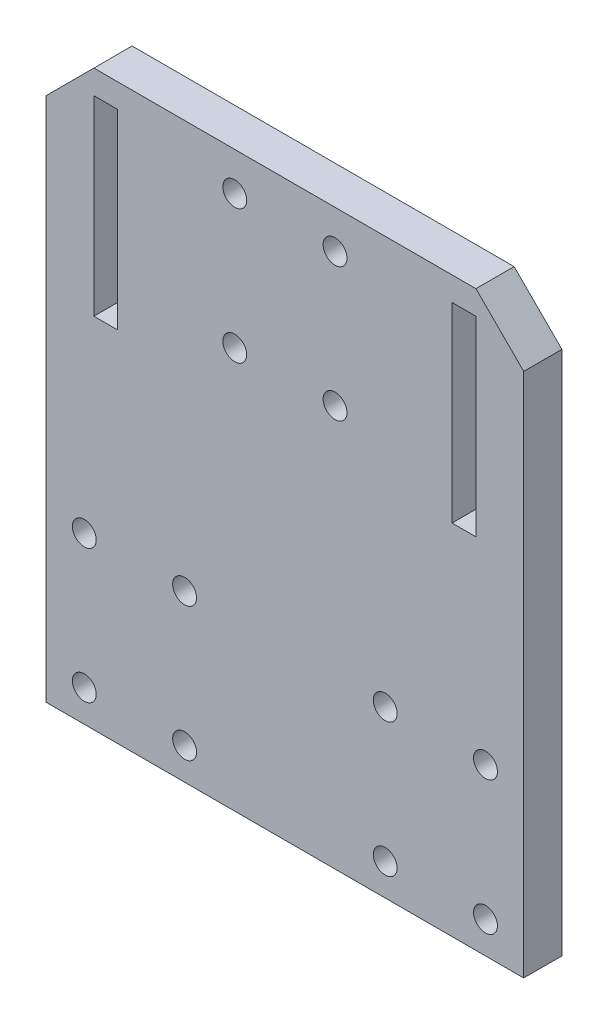
ISO-10303-21;
HEADER;
FILE_DESCRIPTION(('STEP AP214'),'2;1');
FILE_NAME('part.step','',(''),(''),'','','');
FILE_SCHEMA(('AUTOMOTIVE_DESIGN { 1 0 10303 214 1 1 1 1 }'));
ENDSEC;
DATA;
#1=APPLICATION_CONTEXT('core data for automotive mechanical design processes');
#2=APPLICATION_PROTOCOL_DEFINITION('international standard','automotive_design',2000,#1);
#3=PRODUCT_CONTEXT('',#1,'mechanical');
#4=PRODUCT('Part','Part','',(#3));
#5=PRODUCT_RELATED_PRODUCT_CATEGORY('part','',(#4));
#6=PRODUCT_DEFINITION_FORMATION('','',#4);
#7=PRODUCT_DEFINITION_CONTEXT('part definition',#1,'design');
#8=PRODUCT_DEFINITION('design','',#6,#7);
#9=PRODUCT_DEFINITION_SHAPE('','',#8);
#10=(LENGTH_UNIT() NAMED_UNIT(*) SI_UNIT(.MILLI.,.METRE.));
#11=(NAMED_UNIT(*) PLANE_ANGLE_UNIT() SI_UNIT($,.RADIAN.));
#12=(NAMED_UNIT(*) SI_UNIT($,.STERADIAN.) SOLID_ANGLE_UNIT());
#13=UNCERTAINTY_MEASURE_WITH_UNIT(LENGTH_MEASURE(1.E-05),#10,'distance_accuracy_value','');
#14=(GEOMETRIC_REPRESENTATION_CONTEXT(3) GLOBAL_UNCERTAINTY_ASSIGNED_CONTEXT((#13)) GLOBAL_UNIT_ASSIGNED_CONTEXT((#10,
#11,#12)) REPRESENTATION_CONTEXT('',''));
#15=CARTESIAN_POINT('',(0.,0.,0.));
#16=DIRECTION('',(0.,0.,1.));
#17=DIRECTION('',(1.,0.,0.));
#18=AXIS2_PLACEMENT_3D('',#15,#16,#17);
#19=CARTESIAN_POINT('',(0.,0.,4.));
#20=DIRECTION('',(0.,0.,-1.));
#21=DIRECTION('',(-1.,0.,0.));
#22=AXIS2_PLACEMENT_3D('',#19,#20,#21);
#23=PLANE('',#22);
#24=DIRECTION('',(0.,-1.,0.));
#25=VECTOR('',#24,1.);
#26=CARTESIAN_POINT('',(-40.,115.,4.));
#27=LINE('',#26,#25);
#28=CARTESIAN_POINT('',(-40.,115.,4.));
#29=VERTEX_POINT('',#28);
#30=CARTESIAN_POINT('',(-40.,75.,4.));
#31=VERTEX_POINT('',#30);
#32=EDGE_CURVE('E205',#29,#31,#27,.T.);
#33=ORIENTED_EDGE('',*,*,#32,.F.);
#34=DIRECTION('',(-1.,0.,0.));
#35=VECTOR('',#34,1.);
#36=CARTESIAN_POINT('',(-40.,115.,4.));
#37=LINE('',#36,#35);
#38=CARTESIAN_POINT('',(-35.,115.,4.));
#39=VERTEX_POINT('',#38);
#40=EDGE_CURVE('E216',#39,#29,#37,.T.);
#41=ORIENTED_EDGE('',*,*,#40,.F.);
#42=DIRECTION('',(0.,1.,0.));
#43=VECTOR('',#42,1.);
#44=CARTESIAN_POINT('',(-35.,115.,4.));
#45=LINE('',#44,#43);
#46=CARTESIAN_POINT('',(-35.,75.,4.));
#47=VERTEX_POINT('',#46);
#48=EDGE_CURVE('E212',#47,#39,#45,.T.);
#49=ORIENTED_EDGE('',*,*,#48,.F.);
#50=DIRECTION('',(1.,0.,0.));
#51=VECTOR('',#50,1.);
#52=CARTESIAN_POINT('',(-40.,75.,4.));
#53=LINE('',#52,#51);
#54=EDGE_CURVE('E208',#31,#47,#53,.T.);
#55=ORIENTED_EDGE('',*,*,#54,.F.);
#56=EDGE_LOOP('',(#33,#41,#49,#55));
#57=FACE_BOUND('',#56,.T.);
#58=DIRECTION('',(0.,1.,0.));
#59=VECTOR('',#58,1.);
#60=CARTESIAN_POINT('',(50.,0.,4.));
#61=LINE('',#60,#59);
#62=CARTESIAN_POINT('',(50.,0.,4.));
#63=VERTEX_POINT('',#62);
#64=CARTESIAN_POINT('',(50.,110.,4.));
#65=VERTEX_POINT('',#64);
#66=EDGE_CURVE('E351',#63,#65,#61,.T.);
#67=ORIENTED_EDGE('',*,*,#66,.T.);
#68=DIRECTION('',(0.707106781186546,-0.707106781186549,0.));
#69=VECTOR('',#68,1.);
#70=CARTESIAN_POINT('',(40.,120.,4.));
#71=LINE('',#70,#69);
#72=CARTESIAN_POINT('',(40.,120.,4.));
#73=VERTEX_POINT('',#72);
#74=EDGE_CURVE('E55',#65,#73,#71,.F.);
#75=ORIENTED_EDGE('',*,*,#74,.T.);
#76=DIRECTION('',(-1.,0.,0.));
#77=VECTOR('',#76,1.);
#78=CARTESIAN_POINT('',(-50.,120.,4.));
#79=LINE('',#78,#77);
#80=CARTESIAN_POINT('',(-40.,120.,4.));
#81=VERTEX_POINT('',#80);
#82=EDGE_CURVE('E354',#73,#81,#79,.T.);
#83=ORIENTED_EDGE('',*,*,#82,.T.);
#84=DIRECTION('',(0.707106781186549,0.707106781186547,0.));
#85=VECTOR('',#84,1.);
#86=CARTESIAN_POINT('',(-50.,110.,4.));
#87=LINE('',#86,#85);
#88=CARTESIAN_POINT('',(-50.,110.,4.));
#89=VERTEX_POINT('',#88);
#90=EDGE_CURVE('E62',#81,#89,#87,.F.);
#91=ORIENTED_EDGE('',*,*,#90,.T.);
#92=DIRECTION('',(0.,-1.,0.));
#93=VECTOR('',#92,1.);
#94=CARTESIAN_POINT('',(-50.,0.,4.));
#95=LINE('',#94,#93);
#96=CARTESIAN_POINT('',(-50.,0.,4.));
#97=VERTEX_POINT('',#96);
#98=EDGE_CURVE('E344',#89,#97,#95,.T.);
#99=ORIENTED_EDGE('',*,*,#98,.T.);
#100=DIRECTION('',(1.,0.,0.));
#101=VECTOR('',#100,1.);
#102=CARTESIAN_POINT('',(50.,0.,4.));
#103=LINE('',#102,#101);
#104=EDGE_CURVE('E347',#97,#63,#103,.T.);
#105=ORIENTED_EDGE('',*,*,#104,.T.);
#106=EDGE_LOOP('',(#67,#75,#83,#91,#99,#105));
#107=FACE_BOUND('',#106,.T.);
#108=CARTESIAN_POINT('',(-42.,6.66986634029465,4.));
#109=DIRECTION('',(0.,0.,1.));
#110=DIRECTION('',(1.,0.,0.));
#111=AXIS2_PLACEMENT_3D('',#108,#109,#110);
#112=CIRCLE('',#111,2.5);
#113=CARTESIAN_POINT('',(-39.5,6.66986634029465,4.));
#114=VERTEX_POINT('',#113);
#115=EDGE_CURVE('E336',#114,#114,#112,.T.);
#116=ORIENTED_EDGE('',*,*,#115,.F.);
#117=EDGE_LOOP('',(#116));
#118=FACE_BOUND('',#117,.T.);
#119=CARTESIAN_POINT('',(-21.,6.66986634029465,4.));
#120=DIRECTION('',(0.,0.,1.));
#121=DIRECTION('',(1.,0.,0.));
#122=AXIS2_PLACEMENT_3D('',#119,#120,#121);
#123=CIRCLE('',#122,2.5);
#124=CARTESIAN_POINT('',(-18.5,6.66986634029465,4.));
#125=VERTEX_POINT('',#124);
#126=EDGE_CURVE('E328',#125,#125,#123,.T.);
#127=ORIENTED_EDGE('',*,*,#126,.F.);
#128=EDGE_LOOP('',(#127));
#129=FACE_BOUND('',#128,.T.);
#130=CARTESIAN_POINT('',(-42.,34.6698663402946,4.));
#131=DIRECTION('',(0.,0.,1.));
#132=DIRECTION('',(1.,0.,0.));
#133=AXIS2_PLACEMENT_3D('',#130,#131,#132);
#134=CIRCLE('',#133,2.5);
#135=CARTESIAN_POINT('',(-39.5,34.6698663402946,4.));
#136=VERTEX_POINT('',#135);
#137=EDGE_CURVE('E320',#136,#136,#134,.T.);
#138=ORIENTED_EDGE('',*,*,#137,.F.);
#139=EDGE_LOOP('',(#138));
#140=FACE_BOUND('',#139,.T.);
#141=CARTESIAN_POINT('',(-21.,34.6698663402946,4.));
#142=DIRECTION('',(0.,0.,1.));
#143=DIRECTION('',(1.,0.,0.));
#144=AXIS2_PLACEMENT_3D('',#141,#142,#143);
#145=CIRCLE('',#144,2.5);
#146=CARTESIAN_POINT('',(-18.5,34.6698663402946,4.));
#147=VERTEX_POINT('',#146);
#148=EDGE_CURVE('E312',#147,#147,#145,.T.);
#149=ORIENTED_EDGE('',*,*,#148,.F.);
#150=EDGE_LOOP('',(#149));
#151=FACE_BOUND('',#150,.T.);
#152=CARTESIAN_POINT('',(-10.5,112.,4.));
#153=DIRECTION('',(0.,0.,1.));
#154=DIRECTION('',(1.,0.,0.));
#155=AXIS2_PLACEMENT_3D('',#152,#153,#154);
#156=CIRCLE('',#155,2.5);
#157=CARTESIAN_POINT('',(-8.00000000000001,112.,4.));
#158=VERTEX_POINT('',#157);
#159=EDGE_CURVE('E304',#158,#158,#156,.T.);
#160=ORIENTED_EDGE('',*,*,#159,.F.);
#161=EDGE_LOOP('',(#160));
#162=FACE_BOUND('',#161,.T.);
#163=CARTESIAN_POINT('',(-10.5,84.,4.));
#164=DIRECTION('',(0.,0.,1.));
#165=DIRECTION('',(1.,0.,0.));
#166=AXIS2_PLACEMENT_3D('',#163,#164,#165);
#167=CIRCLE('',#166,2.5);
#168=CARTESIAN_POINT('',(-8.00000000000001,84.,4.));
#169=VERTEX_POINT('',#168);
#170=EDGE_CURVE('E296',#169,#169,#167,.T.);
#171=ORIENTED_EDGE('',*,*,#170,.F.);
#172=EDGE_LOOP('',(#171));
#173=FACE_BOUND('',#172,.T.);
#174=CARTESIAN_POINT('',(21.,34.6698663402946,4.));
#175=DIRECTION('',(0.,0.,1.));
#176=DIRECTION('',(-1.,0.,0.));
#177=AXIS2_PLACEMENT_3D('',#174,#175,#176);
#178=CIRCLE('',#177,2.5);
#179=CARTESIAN_POINT('',(18.5,34.6698663402946,4.));
#180=VERTEX_POINT('',#179);
#181=EDGE_CURVE('E288',#180,#180,#178,.T.);
#182=ORIENTED_EDGE('',*,*,#181,.F.);
#183=EDGE_LOOP('',(#182));
#184=FACE_BOUND('',#183,.T.);
#185=CARTESIAN_POINT('',(10.5,84.,4.));
#186=DIRECTION('',(0.,0.,1.));
#187=DIRECTION('',(-1.,0.,0.));
#188=AXIS2_PLACEMENT_3D('',#185,#186,#187);
#189=CIRCLE('',#188,2.5);
#190=CARTESIAN_POINT('',(8.00000000000001,84.,4.));
#191=VERTEX_POINT('',#190);
#192=EDGE_CURVE('E280',#191,#191,#189,.T.);
#193=ORIENTED_EDGE('',*,*,#192,.F.);
#194=EDGE_LOOP('',(#193));
#195=FACE_BOUND('',#194,.T.);
#196=CARTESIAN_POINT('',(10.5,112.,4.));
#197=DIRECTION('',(0.,0.,1.));
#198=DIRECTION('',(-1.,0.,0.));
#199=AXIS2_PLACEMENT_3D('',#196,#197,#198);
#200=CIRCLE('',#199,2.5);
#201=CARTESIAN_POINT('',(8.00000000000001,112.,4.));
#202=VERTEX_POINT('',#201);
#203=EDGE_CURVE('E272',#202,#202,#200,.T.);
#204=ORIENTED_EDGE('',*,*,#203,.F.);
#205=EDGE_LOOP('',(#204));
#206=FACE_BOUND('',#205,.T.);
#207=CARTESIAN_POINT('',(21.,6.66986634029465,4.));
#208=DIRECTION('',(0.,0.,1.));
#209=DIRECTION('',(-1.,0.,0.));
#210=AXIS2_PLACEMENT_3D('',#207,#208,#209);
#211=CIRCLE('',#210,2.5);
#212=CARTESIAN_POINT('',(18.5,6.66986634029465,4.));
#213=VERTEX_POINT('',#212);
#214=EDGE_CURVE('E264',#213,#213,#211,.T.);
#215=ORIENTED_EDGE('',*,*,#214,.F.);
#216=EDGE_LOOP('',(#215));
#217=FACE_BOUND('',#216,.T.);
#218=CARTESIAN_POINT('',(42.,34.6698663402946,4.));
#219=DIRECTION('',(0.,0.,1.));
#220=DIRECTION('',(-1.,0.,0.));
#221=AXIS2_PLACEMENT_3D('',#218,#219,#220);
#222=CIRCLE('',#221,2.5);
#223=CARTESIAN_POINT('',(39.5,34.6698663402946,4.));
#224=VERTEX_POINT('',#223);
#225=EDGE_CURVE('E256',#224,#224,#222,.T.);
#226=ORIENTED_EDGE('',*,*,#225,.F.);
#227=EDGE_LOOP('',(#226));
#228=FACE_BOUND('',#227,.T.);
#229=CARTESIAN_POINT('',(42.,6.66986634029465,4.));
#230=DIRECTION('',(0.,0.,1.));
#231=DIRECTION('',(-1.,0.,0.));
#232=AXIS2_PLACEMENT_3D('',#229,#230,#231);
#233=CIRCLE('',#232,2.5);
#234=CARTESIAN_POINT('',(39.5,6.66986634029465,4.));
#235=VERTEX_POINT('',#234);
#236=EDGE_CURVE('E248',#235,#235,#233,.T.);
#237=ORIENTED_EDGE('',*,*,#236,.F.);
#238=EDGE_LOOP('',(#237));
#239=FACE_BOUND('',#238,.T.);
#240=DIRECTION('',(-1.,0.,0.));
#241=VECTOR('',#240,1.);
#242=CARTESIAN_POINT('',(40.,115.,4.));
#243=LINE('',#242,#241);
#244=CARTESIAN_POINT('',(40.,115.,4.));
#245=VERTEX_POINT('',#244);
#246=CARTESIAN_POINT('',(35.,115.,4.));
#247=VERTEX_POINT('',#246);
#248=EDGE_CURVE('E152',#245,#247,#243,.T.);
#249=ORIENTED_EDGE('',*,*,#248,.F.);
#250=DIRECTION('',(0.,1.,0.));
#251=VECTOR('',#250,1.);
#252=CARTESIAN_POINT('',(40.,115.,4.));
#253=LINE('',#252,#251);
#254=CARTESIAN_POINT('',(40.,75.,4.));
#255=VERTEX_POINT('',#254);
#256=EDGE_CURVE('E181',#255,#245,#253,.T.);
#257=ORIENTED_EDGE('',*,*,#256,.F.);
#258=DIRECTION('',(1.,0.,0.));
#259=VECTOR('',#258,1.);
#260=CARTESIAN_POINT('',(40.,75.,4.));
#261=LINE('',#260,#259);
#262=CARTESIAN_POINT('',(35.,75.,4.));
#263=VERTEX_POINT('',#262);
#264=EDGE_CURVE('E177',#263,#255,#261,.T.);
#265=ORIENTED_EDGE('',*,*,#264,.F.);
#266=DIRECTION('',(0.,-1.,0.));
#267=VECTOR('',#266,1.);
#268=CARTESIAN_POINT('',(35.,115.,4.));
#269=LINE('',#268,#267);
#270=EDGE_CURVE('E163',#247,#263,#269,.T.);
#271=ORIENTED_EDGE('',*,*,#270,.F.);
#272=EDGE_LOOP('',(#249,#257,#265,#271));
#273=FACE_BOUND('',#272,.T.);
#274=ADVANCED_FACE('F45',(#57,#107,#118,#129,#140,#151,#162,#173,#184,#195,#206,#217,#228,#239,
#273),#23,.F.);
#275=CARTESIAN_POINT('',(0.,0.,-4.));
#276=DIRECTION('',(0.,0.,-1.));
#277=DIRECTION('',(-1.,0.,0.));
#278=AXIS2_PLACEMENT_3D('',#275,#276,#277);
#279=PLANE('',#278);
#280=CARTESIAN_POINT('',(42.,34.6698663402946,-4.));
#281=DIRECTION('',(0.,0.,1.));
#282=DIRECTION('',(-1.,0.,0.));
#283=AXIS2_PLACEMENT_3D('',#280,#281,#282);
#284=CIRCLE('',#283,2.5);
#285=CARTESIAN_POINT('',(39.5,34.6698663402946,-4.));
#286=VERTEX_POINT('',#285);
#287=EDGE_CURVE('E252',#286,#286,#284,.T.);
#288=ORIENTED_EDGE('',*,*,#287,.T.);
#289=EDGE_LOOP('',(#288));
#290=FACE_BOUND('',#289,.T.);
#291=CARTESIAN_POINT('',(10.5,112.,-4.));
#292=DIRECTION('',(0.,0.,1.));
#293=DIRECTION('',(-1.,0.,0.));
#294=AXIS2_PLACEMENT_3D('',#291,#292,#293);
#295=CIRCLE('',#294,2.5);
#296=CARTESIAN_POINT('',(8.00000000000001,112.,-4.));
#297=VERTEX_POINT('',#296);
#298=EDGE_CURVE('E268',#297,#297,#295,.T.);
#299=ORIENTED_EDGE('',*,*,#298,.T.);
#300=EDGE_LOOP('',(#299));
#301=FACE_BOUND('',#300,.T.);
#302=CARTESIAN_POINT('',(21.,34.6698663402946,-4.));
#303=DIRECTION('',(0.,0.,1.));
#304=DIRECTION('',(-1.,0.,0.));
#305=AXIS2_PLACEMENT_3D('',#302,#303,#304);
#306=CIRCLE('',#305,2.5);
#307=CARTESIAN_POINT('',(18.5,34.6698663402946,-4.));
#308=VERTEX_POINT('',#307);
#309=EDGE_CURVE('E284',#308,#308,#306,.T.);
#310=ORIENTED_EDGE('',*,*,#309,.T.);
#311=EDGE_LOOP('',(#310));
#312=FACE_BOUND('',#311,.T.);
#313=CARTESIAN_POINT('',(-10.5,112.,-4.));
#314=DIRECTION('',(0.,0.,1.));
#315=DIRECTION('',(1.,0.,0.));
#316=AXIS2_PLACEMENT_3D('',#313,#314,#315);
#317=CIRCLE('',#316,2.5);
#318=CARTESIAN_POINT('',(-8.00000000000001,112.,-4.));
#319=VERTEX_POINT('',#318);
#320=EDGE_CURVE('E300',#319,#319,#317,.T.);
#321=ORIENTED_EDGE('',*,*,#320,.T.);
#322=EDGE_LOOP('',(#321));
#323=FACE_BOUND('',#322,.T.);
#324=CARTESIAN_POINT('',(-42.,34.6698663402946,-4.));
#325=DIRECTION('',(0.,0.,1.));
#326=DIRECTION('',(1.,0.,0.));
#327=AXIS2_PLACEMENT_3D('',#324,#325,#326);
#328=CIRCLE('',#327,2.5);
#329=CARTESIAN_POINT('',(-39.5,34.6698663402946,-4.));
#330=VERTEX_POINT('',#329);
#331=EDGE_CURVE('E316',#330,#330,#328,.T.);
#332=ORIENTED_EDGE('',*,*,#331,.T.);
#333=EDGE_LOOP('',(#332));
#334=FACE_BOUND('',#333,.T.);
#335=CARTESIAN_POINT('',(-42.,6.66986634029465,-4.));
#336=DIRECTION('',(0.,0.,1.));
#337=DIRECTION('',(1.,0.,0.));
#338=AXIS2_PLACEMENT_3D('',#335,#336,#337);
#339=CIRCLE('',#338,2.5);
#340=CARTESIAN_POINT('',(-39.5,6.66986634029465,-4.));
#341=VERTEX_POINT('',#340);
#342=EDGE_CURVE('E332',#341,#341,#339,.T.);
#343=ORIENTED_EDGE('',*,*,#342,.T.);
#344=EDGE_LOOP('',(#343));
#345=FACE_BOUND('',#344,.T.);
#346=DIRECTION('',(-1.,0.,0.));
#347=VECTOR('',#346,1.);
#348=CARTESIAN_POINT('',(-50.,120.,-4.));
#349=LINE('',#348,#347);
#350=CARTESIAN_POINT('',(40.,120.,-4.));
#351=VERTEX_POINT('',#350);
#352=CARTESIAN_POINT('',(-40.,120.,-4.));
#353=VERTEX_POINT('',#352);
#354=EDGE_CURVE('E348',#351,#353,#349,.T.);
#355=ORIENTED_EDGE('',*,*,#354,.F.);
#356=DIRECTION('',(-0.707106781186546,0.707106781186549,0.));
#357=VECTOR('',#356,1.);
#358=CARTESIAN_POINT('',(80.0000000000001,79.9999999999997,-4.));
#359=LINE('',#358,#357);
#360=CARTESIAN_POINT('',(50.,110.,-4.));
#361=VERTEX_POINT('',#360);
#362=EDGE_CURVE('E386',#351,#361,#359,.F.);
#363=ORIENTED_EDGE('',*,*,#362,.T.);
#364=DIRECTION('',(0.,1.,0.));
#365=VECTOR('',#364,1.);
#366=CARTESIAN_POINT('',(50.,0.,-4.));
#367=LINE('',#366,#365);
#368=CARTESIAN_POINT('',(50.,0.,-4.));
#369=VERTEX_POINT('',#368);
#370=EDGE_CURVE('E363',#369,#361,#367,.T.);
#371=ORIENTED_EDGE('',*,*,#370,.F.);
#372=DIRECTION('',(1.,0.,0.));
#373=VECTOR('',#372,1.);
#374=CARTESIAN_POINT('',(50.,0.,-4.));
#375=LINE('',#374,#373);
#376=CARTESIAN_POINT('',(-50.,0.,-4.));
#377=VERTEX_POINT('',#376);
#378=EDGE_CURVE('E360',#377,#369,#375,.T.);
#379=ORIENTED_EDGE('',*,*,#378,.F.);
#380=DIRECTION('',(0.,-1.,0.));
#381=VECTOR('',#380,1.);
#382=CARTESIAN_POINT('',(-50.,0.,-4.));
#383=LINE('',#382,#381);
#384=CARTESIAN_POINT('',(-50.,110.,-4.));
#385=VERTEX_POINT('',#384);
#386=EDGE_CURVE('E340',#385,#377,#383,.T.);
#387=ORIENTED_EDGE('',*,*,#386,.F.);
#388=DIRECTION('',(-0.707106781186549,-0.707106781186547,0.));
#389=VECTOR('',#388,1.);
#390=CARTESIAN_POINT('',(-79.9999999999999,80.0000000000002,-4.));
#391=LINE('',#390,#389);
#392=EDGE_CURVE('E383',#385,#353,#391,.F.);
#393=ORIENTED_EDGE('',*,*,#392,.T.);
#394=EDGE_LOOP('',(#355,#363,#371,#379,#387,#393));
#395=FACE_BOUND('',#394,.T.);
#396=CARTESIAN_POINT('',(-21.,6.66986634029465,-4.));
#397=DIRECTION('',(0.,0.,1.));
#398=DIRECTION('',(1.,0.,0.));
#399=AXIS2_PLACEMENT_3D('',#396,#397,#398);
#400=CIRCLE('',#399,2.5);
#401=CARTESIAN_POINT('',(-18.5,6.66986634029465,-4.));
#402=VERTEX_POINT('',#401);
#403=EDGE_CURVE('E324',#402,#402,#400,.T.);
#404=ORIENTED_EDGE('',*,*,#403,.T.);
#405=EDGE_LOOP('',(#404));
#406=FACE_BOUND('',#405,.T.);
#407=CARTESIAN_POINT('',(-21.,34.6698663402946,-4.));
#408=DIRECTION('',(0.,0.,1.));
#409=DIRECTION('',(1.,0.,0.));
#410=AXIS2_PLACEMENT_3D('',#407,#408,#409);
#411=CIRCLE('',#410,2.5);
#412=CARTESIAN_POINT('',(-18.5,34.6698663402946,-4.));
#413=VERTEX_POINT('',#412);
#414=EDGE_CURVE('E308',#413,#413,#411,.T.);
#415=ORIENTED_EDGE('',*,*,#414,.T.);
#416=EDGE_LOOP('',(#415));
#417=FACE_BOUND('',#416,.T.);
#418=CARTESIAN_POINT('',(-10.5,84.,-4.));
#419=DIRECTION('',(0.,0.,1.));
#420=DIRECTION('',(1.,0.,0.));
#421=AXIS2_PLACEMENT_3D('',#418,#419,#420);
#422=CIRCLE('',#421,2.5);
#423=CARTESIAN_POINT('',(-8.00000000000001,84.,-4.));
#424=VERTEX_POINT('',#423);
#425=EDGE_CURVE('E292',#424,#424,#422,.T.);
#426=ORIENTED_EDGE('',*,*,#425,.T.);
#427=EDGE_LOOP('',(#426));
#428=FACE_BOUND('',#427,.T.);
#429=CARTESIAN_POINT('',(10.5,84.,-4.));
#430=DIRECTION('',(0.,0.,1.));
#431=DIRECTION('',(-1.,0.,0.));
#432=AXIS2_PLACEMENT_3D('',#429,#430,#431);
#433=CIRCLE('',#432,2.5);
#434=CARTESIAN_POINT('',(8.00000000000001,84.,-4.));
#435=VERTEX_POINT('',#434);
#436=EDGE_CURVE('E276',#435,#435,#433,.T.);
#437=ORIENTED_EDGE('',*,*,#436,.T.);
#438=EDGE_LOOP('',(#437));
#439=FACE_BOUND('',#438,.T.);
#440=CARTESIAN_POINT('',(21.,6.66986634029465,-4.));
#441=DIRECTION('',(0.,0.,1.));
#442=DIRECTION('',(-1.,0.,0.));
#443=AXIS2_PLACEMENT_3D('',#440,#441,#442);
#444=CIRCLE('',#443,2.5);
#445=CARTESIAN_POINT('',(18.5,6.66986634029465,-4.));
#446=VERTEX_POINT('',#445);
#447=EDGE_CURVE('E260',#446,#446,#444,.T.);
#448=ORIENTED_EDGE('',*,*,#447,.T.);
#449=EDGE_LOOP('',(#448));
#450=FACE_BOUND('',#449,.T.);
#451=CARTESIAN_POINT('',(42.,6.66986634029465,-4.));
#452=DIRECTION('',(0.,0.,1.));
#453=DIRECTION('',(-1.,0.,0.));
#454=AXIS2_PLACEMENT_3D('',#451,#452,#453);
#455=CIRCLE('',#454,2.5);
#456=CARTESIAN_POINT('',(39.5,6.66986634029465,-4.));
#457=VERTEX_POINT('',#456);
#458=EDGE_CURVE('E247',#457,#457,#455,.T.);
#459=ORIENTED_EDGE('',*,*,#458,.T.);
#460=EDGE_LOOP('',(#459));
#461=FACE_BOUND('',#460,.T.);
#462=DIRECTION('',(-1.,0.,0.));
#463=VECTOR('',#462,1.);
#464=CARTESIAN_POINT('',(-40.,115.,-4.));
#465=LINE('',#464,#463);
#466=CARTESIAN_POINT('',(-35.,115.,-4.));
#467=VERTEX_POINT('',#466);
#468=CARTESIAN_POINT('',(-40.,115.,-4.));
#469=VERTEX_POINT('',#468);
#470=EDGE_CURVE('E209',#467,#469,#465,.T.);
#471=ORIENTED_EDGE('',*,*,#470,.T.);
#472=DIRECTION('',(0.,-1.,0.));
#473=VECTOR('',#472,1.);
#474=CARTESIAN_POINT('',(-40.,115.,-4.));
#475=LINE('',#474,#473);
#476=CARTESIAN_POINT('',(-40.,75.,-4.));
#477=VERTEX_POINT('',#476);
#478=EDGE_CURVE('E172',#469,#477,#475,.T.);
#479=ORIENTED_EDGE('',*,*,#478,.T.);
#480=DIRECTION('',(1.,0.,0.));
#481=VECTOR('',#480,1.);
#482=CARTESIAN_POINT('',(-40.,75.,-4.));
#483=LINE('',#482,#481);
#484=CARTESIAN_POINT('',(-35.,75.,-4.));
#485=VERTEX_POINT('',#484);
#486=EDGE_CURVE('E223',#477,#485,#483,.T.);
#487=ORIENTED_EDGE('',*,*,#486,.T.);
#488=DIRECTION('',(0.,1.,0.));
#489=VECTOR('',#488,1.);
#490=CARTESIAN_POINT('',(-35.,115.,-4.));
#491=LINE('',#490,#489);
#492=EDGE_CURVE('E227',#485,#467,#491,.T.);
#493=ORIENTED_EDGE('',*,*,#492,.T.);
#494=EDGE_LOOP('',(#471,#479,#487,#493));
#495=FACE_BOUND('',#494,.T.);
#496=DIRECTION('',(0.,1.,0.));
#497=VECTOR('',#496,1.);
#498=CARTESIAN_POINT('',(40.,115.,-4.));
#499=LINE('',#498,#497);
#500=CARTESIAN_POINT('',(40.,75.,-4.));
#501=VERTEX_POINT('',#500);
#502=CARTESIAN_POINT('',(40.,115.,-4.));
#503=VERTEX_POINT('',#502);
#504=EDGE_CURVE('E164',#501,#503,#499,.T.);
#505=ORIENTED_EDGE('',*,*,#504,.T.);
#506=DIRECTION('',(-1.,0.,0.));
#507=VECTOR('',#506,1.);
#508=CARTESIAN_POINT('',(40.,115.,-4.));
#509=LINE('',#508,#507);
#510=CARTESIAN_POINT('',(35.,115.,-4.));
#511=VERTEX_POINT('',#510);
#512=EDGE_CURVE('E186',#503,#511,#509,.T.);
#513=ORIENTED_EDGE('',*,*,#512,.T.);
#514=DIRECTION('',(0.,-1.,0.));
#515=VECTOR('',#514,1.);
#516=CARTESIAN_POINT('',(35.,115.,-4.));
#517=LINE('',#516,#515);
#518=CARTESIAN_POINT('',(35.,75.,-4.));
#519=VERTEX_POINT('',#518);
#520=EDGE_CURVE('E170',#511,#519,#517,.T.);
#521=ORIENTED_EDGE('',*,*,#520,.T.);
#522=DIRECTION('',(1.,0.,0.));
#523=VECTOR('',#522,1.);
#524=CARTESIAN_POINT('',(40.,75.,-4.));
#525=LINE('',#524,#523);
#526=EDGE_CURVE('E191',#519,#501,#525,.T.);
#527=ORIENTED_EDGE('',*,*,#526,.T.);
#528=EDGE_LOOP('',(#505,#513,#521,#527));
#529=FACE_BOUND('',#528,.T.);
#530=ADVANCED_FACE('F405',(#290,#301,#312,#323,#334,#345,#395,#406,#417,#428,#439,#450,#461,
#495,#529),#279,.T.);
#531=CARTESIAN_POINT('',(-50.,0.,4.));
#532=DIRECTION('',(1.,0.,0.));
#533=DIRECTION('',(0.,1.,0.));
#534=AXIS2_PLACEMENT_3D('',#531,#532,#533);
#535=PLANE('',#534);
#536=ORIENTED_EDGE('',*,*,#98,.F.);
#537=DIRECTION('',(0.,0.,-1.));
#538=VECTOR('',#537,1.);
#539=CARTESIAN_POINT('',(-50.,110.,4.));
#540=LINE('',#539,#538);
#541=EDGE_CURVE('E11',#89,#385,#540,.T.);
#542=ORIENTED_EDGE('',*,*,#541,.T.);
#543=ORIENTED_EDGE('',*,*,#386,.T.);
#544=DIRECTION('',(0.,0.,-1.));
#545=VECTOR('',#544,1.);
#546=CARTESIAN_POINT('',(-50.,0.,4.));
#547=LINE('',#546,#545);
#548=EDGE_CURVE('E372',#97,#377,#547,.T.);
#549=ORIENTED_EDGE('',*,*,#548,.F.);
#550=EDGE_LOOP('',(#536,#542,#543,#549));
#551=FACE_BOUND('',#550,.T.);
#552=ADVANCED_FACE('F416',(#551),#535,.F.);
#553=CARTESIAN_POINT('',(50.,0.,4.));
#554=DIRECTION('',(0.,1.,0.));
#555=DIRECTION('',(0.,0.,1.));
#556=AXIS2_PLACEMENT_3D('',#553,#554,#555);
#557=PLANE('',#556);
#558=ORIENTED_EDGE('',*,*,#378,.T.);
#559=DIRECTION('',(0.,0.,-1.));
#560=VECTOR('',#559,1.);
#561=CARTESIAN_POINT('',(50.,0.,4.));
#562=LINE('',#561,#560);
#563=EDGE_CURVE('E357',#63,#369,#562,.T.);
#564=ORIENTED_EDGE('',*,*,#563,.F.);
#565=ORIENTED_EDGE('',*,*,#104,.F.);
#566=ORIENTED_EDGE('',*,*,#548,.T.);
#567=EDGE_LOOP('',(#558,#564,#565,#566));
#568=FACE_BOUND('',#567,.T.);
#569=ADVANCED_FACE('F412',(#568),#557,.F.);
#570=CARTESIAN_POINT('',(50.,0.,4.));
#571=DIRECTION('',(-1.,0.,0.));
#572=DIRECTION('',(0.,-1.,0.));
#573=AXIS2_PLACEMENT_3D('',#570,#571,#572);
#574=PLANE('',#573);
#575=ORIENTED_EDGE('',*,*,#370,.T.);
#576=DIRECTION('',(0.,0.,1.));
#577=VECTOR('',#576,1.);
#578=CARTESIAN_POINT('',(50.,110.,4.));
#579=LINE('',#578,#577);
#580=EDGE_CURVE('E70',#361,#65,#579,.T.);
#581=ORIENTED_EDGE('',*,*,#580,.T.);
#582=ORIENTED_EDGE('',*,*,#66,.F.);
#583=ORIENTED_EDGE('',*,*,#563,.T.);
#584=EDGE_LOOP('',(#575,#581,#582,#583));
#585=FACE_BOUND('',#584,.T.);
#586=ADVANCED_FACE('F408',(#585),#574,.F.);
#587=CARTESIAN_POINT('',(-50.,120.,4.));
#588=DIRECTION('',(0.,-1.,0.));
#589=DIRECTION('',(0.,0.,-1.));
#590=AXIS2_PLACEMENT_3D('',#587,#588,#589);
#591=PLANE('',#590);
#592=ORIENTED_EDGE('',*,*,#82,.F.);
#593=DIRECTION('',(0.,0.,-1.));
#594=VECTOR('',#593,1.);
#595=CARTESIAN_POINT('',(40.,120.,4.));
#596=LINE('',#595,#594);
#597=EDGE_CURVE('E379',#73,#351,#596,.T.);
#598=ORIENTED_EDGE('',*,*,#597,.T.);
#599=ORIENTED_EDGE('',*,*,#354,.T.);
#600=DIRECTION('',(0.,0.,1.));
#601=VECTOR('',#600,1.);
#602=CARTESIAN_POINT('',(-40.,120.,4.));
#603=LINE('',#602,#601);
#604=EDGE_CURVE('E376',#353,#81,#603,.T.);
#605=ORIENTED_EDGE('',*,*,#604,.T.);
#606=EDGE_LOOP('',(#592,#598,#599,#605));
#607=FACE_BOUND('',#606,.T.);
#608=ADVANCED_FACE('F399',(#607),#591,.F.);
#609=CARTESIAN_POINT('',(-42.,6.66986634029465,4.));
#610=DIRECTION('',(0.,0.,-1.));
#611=DIRECTION('',(-1.,0.,0.));
#612=AXIS2_PLACEMENT_3D('',#609,#610,#611);
#613=CYLINDRICAL_SURFACE('',#612,2.5);
#614=ORIENTED_EDGE('',*,*,#115,.T.);
#615=EDGE_LOOP('',(#614));
#616=FACE_BOUND('',#615,.T.);
#617=ORIENTED_EDGE('',*,*,#342,.F.);
#618=EDGE_LOOP('',(#617));
#619=FACE_BOUND('',#618,.T.);
#620=ADVANCED_FACE('F434',(#616,#619),#613,.F.);
#621=CARTESIAN_POINT('',(-21.,6.66986634029465,4.));
#622=DIRECTION('',(0.,0.,-1.));
#623=DIRECTION('',(-1.,0.,0.));
#624=AXIS2_PLACEMENT_3D('',#621,#622,#623);
#625=CYLINDRICAL_SURFACE('',#624,2.5);
#626=ORIENTED_EDGE('',*,*,#126,.T.);
#627=EDGE_LOOP('',(#626));
#628=FACE_BOUND('',#627,.T.);
#629=ORIENTED_EDGE('',*,*,#403,.F.);
#630=EDGE_LOOP('',(#629));
#631=FACE_BOUND('',#630,.T.);
#632=ADVANCED_FACE('F472',(#628,#631),#625,.F.);
#633=CARTESIAN_POINT('',(-42.,34.6698663402946,4.));
#634=DIRECTION('',(0.,0.,-1.));
#635=DIRECTION('',(-1.,0.,0.));
#636=AXIS2_PLACEMENT_3D('',#633,#634,#635);
#637=CYLINDRICAL_SURFACE('',#636,2.5);
#638=ORIENTED_EDGE('',*,*,#137,.T.);
#639=EDGE_LOOP('',(#638));
#640=FACE_BOUND('',#639,.T.);
#641=ORIENTED_EDGE('',*,*,#331,.F.);
#642=EDGE_LOOP('',(#641));
#643=FACE_BOUND('',#642,.T.);
#644=ADVANCED_FACE('F479',(#640,#643),#637,.F.);
#645=CARTESIAN_POINT('',(-21.,34.6698663402946,4.));
#646=DIRECTION('',(0.,0.,-1.));
#647=DIRECTION('',(-1.,0.,0.));
#648=AXIS2_PLACEMENT_3D('',#645,#646,#647);
#649=CYLINDRICAL_SURFACE('',#648,2.5);
#650=ORIENTED_EDGE('',*,*,#148,.T.);
#651=EDGE_LOOP('',(#650));
#652=FACE_BOUND('',#651,.T.);
#653=ORIENTED_EDGE('',*,*,#414,.F.);
#654=EDGE_LOOP('',(#653));
#655=FACE_BOUND('',#654,.T.);
#656=ADVANCED_FACE('F486',(#652,#655),#649,.F.);
#657=CARTESIAN_POINT('',(-10.5,112.,4.));
#658=DIRECTION('',(0.,0.,-1.));
#659=DIRECTION('',(-1.,0.,0.));
#660=AXIS2_PLACEMENT_3D('',#657,#658,#659);
#661=CYLINDRICAL_SURFACE('',#660,2.5);
#662=ORIENTED_EDGE('',*,*,#159,.T.);
#663=EDGE_LOOP('',(#662));
#664=FACE_BOUND('',#663,.T.);
#665=ORIENTED_EDGE('',*,*,#320,.F.);
#666=EDGE_LOOP('',(#665));
#667=FACE_BOUND('',#666,.T.);
#668=ADVANCED_FACE('F494',(#664,#667),#661,.F.);
#669=CARTESIAN_POINT('',(-10.5,84.,4.));
#670=DIRECTION('',(0.,0.,-1.));
#671=DIRECTION('',(-1.,0.,0.));
#672=AXIS2_PLACEMENT_3D('',#669,#670,#671);
#673=CYLINDRICAL_SURFACE('',#672,2.5);
#674=ORIENTED_EDGE('',*,*,#170,.T.);
#675=EDGE_LOOP('',(#674));
#676=FACE_BOUND('',#675,.T.);
#677=ORIENTED_EDGE('',*,*,#425,.F.);
#678=EDGE_LOOP('',(#677));
#679=FACE_BOUND('',#678,.T.);
#680=ADVANCED_FACE('F502',(#676,#679),#673,.F.);
#681=CARTESIAN_POINT('',(21.,34.6698663402946,4.));
#682=DIRECTION('',(0.,0.,-1.));
#683=DIRECTION('',(-1.,0.,0.));
#684=AXIS2_PLACEMENT_3D('',#681,#682,#683);
#685=CYLINDRICAL_SURFACE('',#684,2.5);
#686=ORIENTED_EDGE('',*,*,#181,.T.);
#687=EDGE_LOOP('',(#686));
#688=FACE_BOUND('',#687,.T.);
#689=ORIENTED_EDGE('',*,*,#309,.F.);
#690=EDGE_LOOP('',(#689));
#691=FACE_BOUND('',#690,.T.);
#692=ADVANCED_FACE('F510',(#688,#691),#685,.F.);
#693=CARTESIAN_POINT('',(10.5,84.,4.));
#694=DIRECTION('',(0.,0.,-1.));
#695=DIRECTION('',(-1.,0.,0.));
#696=AXIS2_PLACEMENT_3D('',#693,#694,#695);
#697=CYLINDRICAL_SURFACE('',#696,2.5);
#698=ORIENTED_EDGE('',*,*,#192,.T.);
#699=EDGE_LOOP('',(#698));
#700=FACE_BOUND('',#699,.T.);
#701=ORIENTED_EDGE('',*,*,#436,.F.);
#702=EDGE_LOOP('',(#701));
#703=FACE_BOUND('',#702,.T.);
#704=ADVANCED_FACE('F518',(#700,#703),#697,.F.);
#705=CARTESIAN_POINT('',(10.5,112.,4.));
#706=DIRECTION('',(0.,0.,-1.));
#707=DIRECTION('',(-1.,0.,0.));
#708=AXIS2_PLACEMENT_3D('',#705,#706,#707);
#709=CYLINDRICAL_SURFACE('',#708,2.5);
#710=ORIENTED_EDGE('',*,*,#203,.T.);
#711=EDGE_LOOP('',(#710));
#712=FACE_BOUND('',#711,.T.);
#713=ORIENTED_EDGE('',*,*,#298,.F.);
#714=EDGE_LOOP('',(#713));
#715=FACE_BOUND('',#714,.T.);
#716=ADVANCED_FACE('F526',(#712,#715),#709,.F.);
#717=CARTESIAN_POINT('',(21.,6.66986634029465,4.));
#718=DIRECTION('',(0.,0.,-1.));
#719=DIRECTION('',(-1.,0.,0.));
#720=AXIS2_PLACEMENT_3D('',#717,#718,#719);
#721=CYLINDRICAL_SURFACE('',#720,2.5);
#722=ORIENTED_EDGE('',*,*,#214,.T.);
#723=EDGE_LOOP('',(#722));
#724=FACE_BOUND('',#723,.T.);
#725=ORIENTED_EDGE('',*,*,#447,.F.);
#726=EDGE_LOOP('',(#725));
#727=FACE_BOUND('',#726,.T.);
#728=ADVANCED_FACE('F534',(#724,#727),#721,.F.);
#729=CARTESIAN_POINT('',(42.,34.6698663402946,4.));
#730=DIRECTION('',(0.,0.,-1.));
#731=DIRECTION('',(-1.,0.,0.));
#732=AXIS2_PLACEMENT_3D('',#729,#730,#731);
#733=CYLINDRICAL_SURFACE('',#732,2.5);
#734=ORIENTED_EDGE('',*,*,#225,.T.);
#735=EDGE_LOOP('',(#734));
#736=FACE_BOUND('',#735,.T.);
#737=ORIENTED_EDGE('',*,*,#287,.F.);
#738=EDGE_LOOP('',(#737));
#739=FACE_BOUND('',#738,.T.);
#740=ADVANCED_FACE('F542',(#736,#739),#733,.F.);
#741=CARTESIAN_POINT('',(42.,6.66986634029465,4.));
#742=DIRECTION('',(0.,0.,-1.));
#743=DIRECTION('',(-1.,0.,0.));
#744=AXIS2_PLACEMENT_3D('',#741,#742,#743);
#745=CYLINDRICAL_SURFACE('',#744,2.5);
#746=ORIENTED_EDGE('',*,*,#236,.T.);
#747=EDGE_LOOP('',(#746));
#748=FACE_BOUND('',#747,.T.);
#749=ORIENTED_EDGE('',*,*,#458,.F.);
#750=EDGE_LOOP('',(#749));
#751=FACE_BOUND('',#750,.T.);
#752=ADVANCED_FACE('F550',(#748,#751),#745,.F.);
#753=CARTESIAN_POINT('',(-40.,115.,4.));
#754=DIRECTION('',(1.,0.,0.));
#755=DIRECTION('',(0.,1.,0.));
#756=AXIS2_PLACEMENT_3D('',#753,#754,#755);
#757=PLANE('',#756);
#758=ORIENTED_EDGE('',*,*,#478,.F.);
#759=DIRECTION('',(0.,0.,-1.));
#760=VECTOR('',#759,1.);
#761=CARTESIAN_POINT('',(-40.,115.,4.));
#762=LINE('',#761,#760);
#763=EDGE_CURVE('E219',#29,#469,#762,.T.);
#764=ORIENTED_EDGE('',*,*,#763,.F.);
#765=ORIENTED_EDGE('',*,*,#32,.T.);
#766=DIRECTION('',(0.,0.,-1.));
#767=VECTOR('',#766,1.);
#768=CARTESIAN_POINT('',(-40.,75.,4.));
#769=LINE('',#768,#767);
#770=EDGE_CURVE('E243',#31,#477,#769,.T.);
#771=ORIENTED_EDGE('',*,*,#770,.T.);
#772=EDGE_LOOP('',(#758,#764,#765,#771));
#773=FACE_BOUND('',#772,.T.);
#774=ADVANCED_FACE('F558',(#773),#757,.T.);
#775=CARTESIAN_POINT('',(-40.,75.,4.));
#776=DIRECTION('',(0.,1.,0.));
#777=DIRECTION('',(0.,0.,1.));
#778=AXIS2_PLACEMENT_3D('',#775,#776,#777);
#779=PLANE('',#778);
#780=ORIENTED_EDGE('',*,*,#486,.F.);
#781=ORIENTED_EDGE('',*,*,#770,.F.);
#782=ORIENTED_EDGE('',*,*,#54,.T.);
#783=DIRECTION('',(0.,0.,-1.));
#784=VECTOR('',#783,1.);
#785=CARTESIAN_POINT('',(-35.,75.,4.));
#786=LINE('',#785,#784);
#787=EDGE_CURVE('E240',#47,#485,#786,.T.);
#788=ORIENTED_EDGE('',*,*,#787,.T.);
#789=EDGE_LOOP('',(#780,#781,#782,#788));
#790=FACE_BOUND('',#789,.T.);
#791=ADVANCED_FACE('F566',(#790),#779,.T.);
#792=CARTESIAN_POINT('',(-35.,115.,4.));
#793=DIRECTION('',(-1.,0.,0.));
#794=DIRECTION('',(0.,-1.,0.));
#795=AXIS2_PLACEMENT_3D('',#792,#793,#794);
#796=PLANE('',#795);
#797=ORIENTED_EDGE('',*,*,#492,.F.);
#798=ORIENTED_EDGE('',*,*,#787,.F.);
#799=ORIENTED_EDGE('',*,*,#48,.T.);
#800=DIRECTION('',(0.,0.,-1.));
#801=VECTOR('',#800,1.);
#802=CARTESIAN_POINT('',(-35.,115.,4.));
#803=LINE('',#802,#801);
#804=EDGE_CURVE('E237',#39,#467,#803,.T.);
#805=ORIENTED_EDGE('',*,*,#804,.T.);
#806=EDGE_LOOP('',(#797,#798,#799,#805));
#807=FACE_BOUND('',#806,.T.);
#808=ADVANCED_FACE('F574',(#807),#796,.T.);
#809=CARTESIAN_POINT('',(-40.,115.,4.));
#810=DIRECTION('',(0.,-1.,0.));
#811=DIRECTION('',(0.,0.,-1.));
#812=AXIS2_PLACEMENT_3D('',#809,#810,#811);
#813=PLANE('',#812);
#814=ORIENTED_EDGE('',*,*,#470,.F.);
#815=ORIENTED_EDGE('',*,*,#804,.F.);
#816=ORIENTED_EDGE('',*,*,#40,.T.);
#817=ORIENTED_EDGE('',*,*,#763,.T.);
#818=EDGE_LOOP('',(#814,#815,#816,#817));
#819=FACE_BOUND('',#818,.T.);
#820=ADVANCED_FACE('F582',(#819),#813,.T.);
#821=CARTESIAN_POINT('',(40.,115.,4.));
#822=DIRECTION('',(0.,-1.,0.));
#823=DIRECTION('',(0.,0.,-1.));
#824=AXIS2_PLACEMENT_3D('',#821,#822,#823);
#825=PLANE('',#824);
#826=ORIENTED_EDGE('',*,*,#512,.F.);
#827=DIRECTION('',(0.,0.,-1.));
#828=VECTOR('',#827,1.);
#829=CARTESIAN_POINT('',(40.,115.,4.));
#830=LINE('',#829,#828);
#831=EDGE_CURVE('E158',#245,#503,#830,.T.);
#832=ORIENTED_EDGE('',*,*,#831,.F.);
#833=ORIENTED_EDGE('',*,*,#248,.T.);
#834=DIRECTION('',(0.,0.,-1.));
#835=VECTOR('',#834,1.);
#836=CARTESIAN_POINT('',(35.,115.,4.));
#837=LINE('',#836,#835);
#838=EDGE_CURVE('E155',#247,#511,#837,.T.);
#839=ORIENTED_EDGE('',*,*,#838,.T.);
#840=EDGE_LOOP('',(#826,#832,#833,#839));
#841=FACE_BOUND('',#840,.T.);
#842=ADVANCED_FACE('F154',(#841),#825,.T.);
#843=CARTESIAN_POINT('',(35.,115.,4.));
#844=DIRECTION('',(1.,0.,0.));
#845=DIRECTION('',(0.,1.,0.));
#846=AXIS2_PLACEMENT_3D('',#843,#844,#845);
#847=PLANE('',#846);
#848=ORIENTED_EDGE('',*,*,#520,.F.);
#849=ORIENTED_EDGE('',*,*,#838,.F.);
#850=ORIENTED_EDGE('',*,*,#270,.T.);
#851=DIRECTION('',(0.,0.,-1.));
#852=VECTOR('',#851,1.);
#853=CARTESIAN_POINT('',(35.,75.,4.));
#854=LINE('',#853,#852);
#855=EDGE_CURVE('E173',#263,#519,#854,.T.);
#856=ORIENTED_EDGE('',*,*,#855,.T.);
#857=EDGE_LOOP('',(#848,#849,#850,#856));
#858=FACE_BOUND('',#857,.T.);
#859=ADVANCED_FACE('F167',(#858),#847,.T.);
#860=CARTESIAN_POINT('',(40.,75.,4.));
#861=DIRECTION('',(0.,1.,0.));
#862=DIRECTION('',(0.,0.,1.));
#863=AXIS2_PLACEMENT_3D('',#860,#861,#862);
#864=PLANE('',#863);
#865=ORIENTED_EDGE('',*,*,#526,.F.);
#866=ORIENTED_EDGE('',*,*,#855,.F.);
#867=ORIENTED_EDGE('',*,*,#264,.T.);
#868=DIRECTION('',(0.,0.,-1.));
#869=VECTOR('',#868,1.);
#870=CARTESIAN_POINT('',(40.,75.,4.));
#871=LINE('',#870,#869);
#872=EDGE_CURVE('E200',#255,#501,#871,.T.);
#873=ORIENTED_EDGE('',*,*,#872,.T.);
#874=EDGE_LOOP('',(#865,#866,#867,#873));
#875=FACE_BOUND('',#874,.T.);
#876=ADVANCED_FACE('F603',(#875),#864,.T.);
#877=CARTESIAN_POINT('',(40.,115.,4.));
#878=DIRECTION('',(-1.,0.,0.));
#879=DIRECTION('',(0.,-1.,0.));
#880=AXIS2_PLACEMENT_3D('',#877,#878,#879);
#881=PLANE('',#880);
#882=ORIENTED_EDGE('',*,*,#504,.F.);
#883=ORIENTED_EDGE('',*,*,#872,.F.);
#884=ORIENTED_EDGE('',*,*,#256,.T.);
#885=ORIENTED_EDGE('',*,*,#831,.T.);
#886=EDGE_LOOP('',(#882,#883,#884,#885));
#887=FACE_BOUND('',#886,.T.);
#888=ADVANCED_FACE('F423',(#887),#881,.T.);
#889=CARTESIAN_POINT('',(40.,120.,4.));
#890=DIRECTION('',(-0.707106781186549,-0.707106781186546,0.));
#891=DIRECTION('',(0.,0.,-1.));
#892=AXIS2_PLACEMENT_3D('',#889,#890,#891);
#893=PLANE('',#892);
#894=ORIENTED_EDGE('',*,*,#74,.F.);
#895=ORIENTED_EDGE('',*,*,#580,.F.);
#896=ORIENTED_EDGE('',*,*,#362,.F.);
#897=ORIENTED_EDGE('',*,*,#597,.F.);
#898=EDGE_LOOP('',(#894,#895,#896,#897));
#899=FACE_BOUND('',#898,.T.);
#900=ADVANCED_FACE('F402',(#899),#893,.F.);
#901=CARTESIAN_POINT('',(-50.,110.,4.));
#902=DIRECTION('',(0.707106781186547,-0.707106781186549,0.));
#903=DIRECTION('',(0.,0.,-1.));
#904=AXIS2_PLACEMENT_3D('',#901,#902,#903);
#905=PLANE('',#904);
#906=ORIENTED_EDGE('',*,*,#90,.F.);
#907=ORIENTED_EDGE('',*,*,#604,.F.);
#908=ORIENTED_EDGE('',*,*,#392,.F.);
#909=ORIENTED_EDGE('',*,*,#541,.F.);
#910=EDGE_LOOP('',(#906,#907,#908,#909));
#911=FACE_BOUND('',#910,.T.);
#912=ADVANCED_FACE('F48',(#911),#905,.F.);
#913=CLOSED_SHELL('',(#274,#530,#552,#569,#586,#608,#620,#632,#644,#656,#668,#680,#692,#704,
#716,#728,#740,#752,#774,#791,#808,#820,#842,#859,#876,#888,#900,#912));
#914=MANIFOLD_SOLID_BREP('B2',#913);
#915=ADVANCED_BREP_SHAPE_REPRESENTATION('',(#18,#914),#14);
#916=SHAPE_DEFINITION_REPRESENTATION(#9,#915);
ENDSEC;
END-ISO-10303-21;
